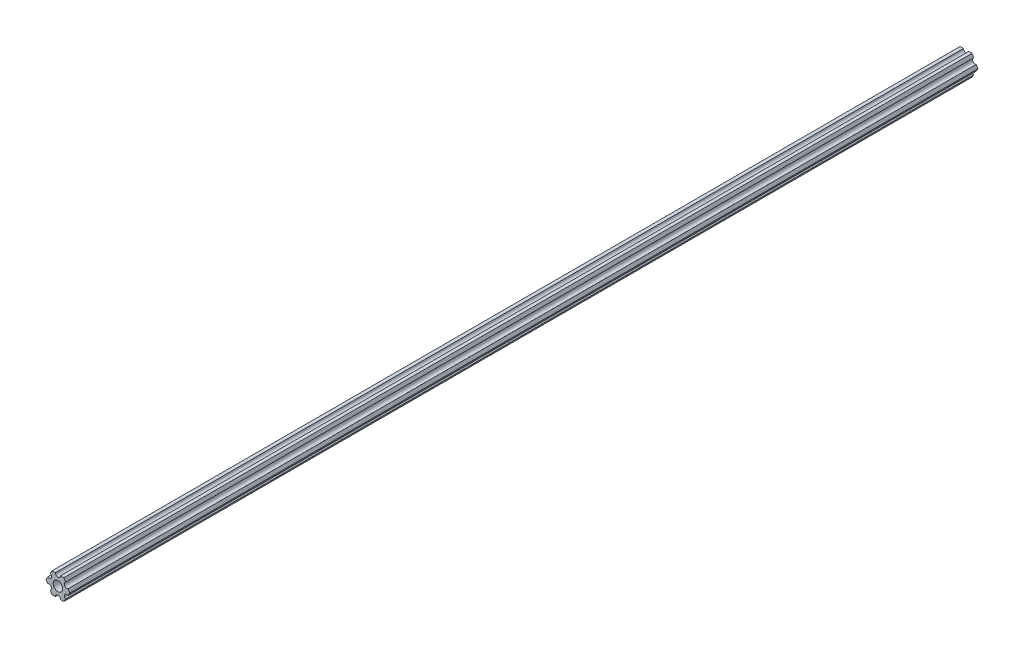
ISO-10303-21;
HEADER;
FILE_DESCRIPTION(('STEP AP214'),'2;1');
FILE_NAME('part.step','',(''),(''),'','','');
FILE_SCHEMA(('AUTOMOTIVE_DESIGN { 1 0 10303 214 1 1 1 1 }'));
ENDSEC;
DATA;
#1=APPLICATION_CONTEXT('core data for automotive mechanical design processes');
#2=APPLICATION_PROTOCOL_DEFINITION('international standard','automotive_design',2000,#1);
#3=PRODUCT_CONTEXT('',#1,'mechanical');
#4=PRODUCT('Part','Part','',(#3));
#5=PRODUCT_RELATED_PRODUCT_CATEGORY('part','',(#4));
#6=PRODUCT_DEFINITION_FORMATION('','',#4);
#7=PRODUCT_DEFINITION_CONTEXT('part definition',#1,'design');
#8=PRODUCT_DEFINITION('design','',#6,#7);
#9=PRODUCT_DEFINITION_SHAPE('','',#8);
#10=(LENGTH_UNIT() NAMED_UNIT(*) SI_UNIT(.MILLI.,.METRE.));
#11=(NAMED_UNIT(*) PLANE_ANGLE_UNIT() SI_UNIT($,.RADIAN.));
#12=(NAMED_UNIT(*) SI_UNIT($,.STERADIAN.) SOLID_ANGLE_UNIT());
#13=UNCERTAINTY_MEASURE_WITH_UNIT(LENGTH_MEASURE(1.E-05),#10,'distance_accuracy_value','');
#14=(GEOMETRIC_REPRESENTATION_CONTEXT(3) GLOBAL_UNCERTAINTY_ASSIGNED_CONTEXT((#13)) GLOBAL_UNIT_ASSIGNED_CONTEXT((#10,
#11,#12)) REPRESENTATION_CONTEXT('',''));
#15=CARTESIAN_POINT('',(0.,0.,0.));
#16=DIRECTION('',(0.,0.,1.));
#17=DIRECTION('',(1.,0.,0.));
#18=AXIS2_PLACEMENT_3D('',#15,#16,#17);
#19=CARTESIAN_POINT('',(6.29301142309098,-1.80018429024546,85.725));
#20=DIRECTION('',(-0.866025434075723,0.499999947533953,0.));
#21=DIRECTION('',(0.,0.,1.));
#22=AXIS2_PLACEMENT_3D('',#19,#20,#21);
#23=PLANE('',#22);
#24=DIRECTION('',(0.,0.,1.));
#25=VECTOR('',#24,1.);
#26=CARTESIAN_POINT('',(7.33234841870827,4.44212519169686E-07,85.725));
#27=LINE('',#26,#25);
#28=CARTESIAN_POINT('',(7.33234841870826,4.44212518961143E-07,-473.075));
#29=VERTEX_POINT('',#28);
#30=CARTESIAN_POINT('',(7.33234841870826,4.44212519315656E-07,85.725));
#31=VERTEX_POINT('',#30);
#32=EDGE_CURVE('E12',#29,#31,#27,.T.);
#33=ORIENTED_EDGE('',*,*,#32,.T.);
#34=DIRECTION('',(0.499999947533953,0.866025434075723,0.));
#35=VECTOR('',#34,1.);
#36=CARTESIAN_POINT('',(6.29301142309098,-1.80018429024546,85.725));
#37=LINE('',#36,#35);
#38=CARTESIAN_POINT('',(6.29301142309098,-1.80018429024546,85.725));
#39=VERTEX_POINT('',#38);
#40=EDGE_CURVE('E303',#39,#31,#37,.T.);
#41=ORIENTED_EDGE('',*,*,#40,.F.);
#42=DIRECTION('',(0.,0.,-1.));
#43=VECTOR('',#42,1.);
#44=CARTESIAN_POINT('',(6.29301142309098,-1.80018429024546,85.725));
#45=LINE('',#44,#43);
#46=CARTESIAN_POINT('',(6.29301142309098,-1.80018429024546,-473.075));
#47=VERTEX_POINT('',#46);
#48=EDGE_CURVE('E302',#39,#47,#45,.T.);
#49=ORIENTED_EDGE('',*,*,#48,.T.);
#50=DIRECTION('',(-0.499999947533953,-0.866025434075723,0.));
#51=VECTOR('',#50,1.);
#52=CARTESIAN_POINT('',(6.29301142309098,-1.80018429024546,-473.075));
#53=LINE('',#52,#51);
#54=EDGE_CURVE('E221',#29,#47,#53,.T.);
#55=ORIENTED_EDGE('',*,*,#54,.F.);
#56=EDGE_LOOP('',(#33,#41,#49,#55));
#57=FACE_BOUND('',#56,.T.);
#58=ADVANCED_FACE('F53',(#57),#23,.F.);
#59=CARTESIAN_POINT('',(7.33234841870827,4.44212519169686E-07,85.725));
#60=DIRECTION('',(-0.866025373493145,-0.500000052466057,0.));
#61=DIRECTION('',(-0.500000052466057,0.866025373493145,0.));
#62=AXIS2_PLACEMENT_3D('',#59,#60,#61);
#63=PLANE('',#62);
#64=DIRECTION('',(0.,0.,1.));
#65=VECTOR('',#64,1.);
#66=CARTESIAN_POINT('',(6.29301120497139,1.80018505273894,85.725));
#67=LINE('',#66,#65);
#68=CARTESIAN_POINT('',(6.29301120497139,1.80018505273894,-473.075));
#69=VERTEX_POINT('',#68);
#70=CARTESIAN_POINT('',(6.29301120497139,1.80018505273894,85.725));
#71=VERTEX_POINT('',#70);
#72=EDGE_CURVE('E61',#69,#71,#67,.T.);
#73=ORIENTED_EDGE('',*,*,#72,.T.);
#74=DIRECTION('',(-0.500000052466057,0.866025373493145,0.));
#75=VECTOR('',#74,1.);
#76=CARTESIAN_POINT('',(7.33234841870827,4.44212519198906E-07,85.725));
#77=LINE('',#76,#75);
#78=EDGE_CURVE('E307',#31,#71,#77,.T.);
#79=ORIENTED_EDGE('',*,*,#78,.F.);
#80=ORIENTED_EDGE('',*,*,#32,.F.);
#81=DIRECTION('',(0.500000052466055,-0.866025373493145,0.));
#82=VECTOR('',#81,1.);
#83=CARTESIAN_POINT('',(7.33234841870826,4.44212518961143E-07,-473.075));
#84=LINE('',#83,#82);
#85=EDGE_CURVE('E215',#69,#29,#84,.T.);
#86=ORIENTED_EDGE('',*,*,#85,.F.);
#87=EDGE_LOOP('',(#73,#79,#80,#86));
#88=FACE_BOUND('',#87,.T.);
#89=ADVANCED_FACE('F216',(#88),#63,.F.);
#90=CARTESIAN_POINT('',(4.70551103839172,4.54981561357972,85.725));
#91=DIRECTION('',(-0.866025373493151,-0.500000052466046,0.));
#92=DIRECTION('',(-0.500000052466046,0.866025373493151,0.));
#93=AXIS2_PLACEMENT_3D('',#90,#91,#92);
#94=PLANE('',#93);
#95=DIRECTION('',(0.,0.,1.));
#96=VECTOR('',#95,1.);
#97=CARTESIAN_POINT('',(3.66617382465481,6.35000022210627,85.725));
#98=LINE('',#97,#96);
#99=CARTESIAN_POINT('',(3.66617382465481,6.35000022210627,-473.075));
#100=VERTEX_POINT('',#99);
#101=CARTESIAN_POINT('',(3.66617382465481,6.35000022210627,85.725));
#102=VERTEX_POINT('',#101);
#103=EDGE_CURVE('E213',#100,#102,#98,.T.);
#104=ORIENTED_EDGE('',*,*,#103,.T.);
#105=DIRECTION('',(-0.500000052466046,0.866025373493151,0.));
#106=VECTOR('',#105,1.);
#107=CARTESIAN_POINT('',(4.70551103839172,4.54981561357972,85.725));
#108=LINE('',#107,#106);
#109=CARTESIAN_POINT('',(4.70551103839172,4.54981561357972,85.725));
#110=VERTEX_POINT('',#109);
#111=EDGE_CURVE('E338',#110,#102,#108,.T.);
#112=ORIENTED_EDGE('',*,*,#111,.F.);
#113=DIRECTION('',(0.,0.,1.));
#114=VECTOR('',#113,1.);
#115=CARTESIAN_POINT('',(4.70551103839172,4.54981561357972,85.725));
#116=LINE('',#115,#114);
#117=CARTESIAN_POINT('',(4.70551103839172,4.54981561357972,-473.075));
#118=VERTEX_POINT('',#117);
#119=EDGE_CURVE('E301',#118,#110,#116,.T.);
#120=ORIENTED_EDGE('',*,*,#119,.F.);
#121=DIRECTION('',(0.500000052466045,-0.866025373493151,0.));
#122=VECTOR('',#121,1.);
#123=CARTESIAN_POINT('',(4.70551103839172,4.54981561357972,-473.075));
#124=LINE('',#123,#122);
#125=EDGE_CURVE('E227',#100,#118,#124,.T.);
#126=ORIENTED_EDGE('',*,*,#125,.F.);
#127=EDGE_LOOP('',(#104,#112,#120,#126));
#128=FACE_BOUND('',#127,.T.);
#129=ADVANCED_FACE('F414',(#128),#94,.F.);
#130=CARTESIAN_POINT('',(3.66617382465481,6.35000022210627,85.725));
#131=DIRECTION('',(6.05825850611185E-08,-1.,0.));
#132=DIRECTION('',(0.,0.,-1.));
#133=AXIS2_PLACEMENT_3D('',#130,#131,#132);
#134=PLANE('',#133);
#135=DIRECTION('',(0.,0.,1.));
#136=VECTOR('',#135,1.);
#137=CARTESIAN_POINT('',(1.58749961530074,6.35000009617482,85.725));
#138=LINE('',#137,#136);
#139=CARTESIAN_POINT('',(1.58749961530073,6.35000015914054,-473.075));
#140=VERTEX_POINT('',#139);
#141=CARTESIAN_POINT('',(1.58749961530073,6.35000015914054,85.725));
#142=VERTEX_POINT('',#141);
#143=EDGE_CURVE('E335',#140,#142,#138,.T.);
#144=ORIENTED_EDGE('',*,*,#143,.T.);
#145=DIRECTION('',(-1.,0.,0.));
#146=VECTOR('',#145,1.);
#147=CARTESIAN_POINT('',(5.49926112168156,6.35000022210627,85.725));
#148=LINE('',#147,#146);
#149=EDGE_CURVE('E342',#102,#142,#148,.T.);
#150=ORIENTED_EDGE('',*,*,#149,.F.);
#151=ORIENTED_EDGE('',*,*,#103,.F.);
#152=DIRECTION('',(1.,3.02912931564594E-08,0.));
#153=VECTOR('',#152,1.);
#154=CARTESIAN_POINT('',(3.66617382465481,6.35000022210627,-473.075));
#155=LINE('',#154,#153);
#156=EDGE_CURVE('E289',#140,#100,#155,.T.);
#157=ORIENTED_EDGE('',*,*,#156,.F.);
#158=EDGE_LOOP('',(#144,#150,#151,#157));
#159=FACE_BOUND('',#158,.T.);
#160=ADVANCED_FACE('F417',(#159),#134,.F.);
#161=CARTESIAN_POINT('',(-3.84699260060323E-07,6.35,85.725));
#162=DIRECTION('',(0.,0.,-1.));
#163=DIRECTION('',(-1.,0.,0.));
#164=AXIS2_PLACEMENT_3D('',#161,#162,#163);
#165=CYLINDRICAL_SURFACE('',#164,1.5875);
#166=DIRECTION('',(0.,0.,1.));
#167=VECTOR('',#166,1.);
#168=CARTESIAN_POINT('',(-1.58750038469926,6.34999990382518,85.725));
#169=LINE('',#168,#167);
#170=CARTESIAN_POINT('',(-1.58750038469926,6.34999990382519,-473.075));
#171=VERTEX_POINT('',#170);
#172=CARTESIAN_POINT('',(-1.58750038469926,6.34999990382519,85.725));
#173=VERTEX_POINT('',#172);
#174=EDGE_CURVE('E332',#171,#173,#169,.T.);
#175=ORIENTED_EDGE('',*,*,#174,.T.);
#176=CARTESIAN_POINT('',(-3.84699260060323E-07,6.35,85.725));
#177=DIRECTION('',(0.,0.,-1.));
#178=DIRECTION('',(-1.,0.,0.));
#179=AXIS2_PLACEMENT_3D('',#176,#177,#178);
#180=CIRCLE('',#179,1.5875);
#181=EDGE_CURVE('E346',#142,#173,#180,.T.);
#182=ORIENTED_EDGE('',*,*,#181,.F.);
#183=ORIENTED_EDGE('',*,*,#143,.F.);
#184=CARTESIAN_POINT('',(-3.84699260060323E-07,6.35,-473.075));
#185=DIRECTION('',(0.,0.,1.));
#186=DIRECTION('',(-1.,0.,0.));
#187=AXIS2_PLACEMENT_3D('',#184,#185,#186);
#188=CIRCLE('',#187,1.5875);
#189=EDGE_CURVE('E285',#171,#140,#188,.T.);
#190=ORIENTED_EDGE('',*,*,#189,.F.);
#191=EDGE_LOOP('',(#175,#182,#183,#190));
#192=FACE_BOUND('',#191,.T.);
#193=ADVANCED_FACE('F466',(#192),#165,.F.);
#194=CARTESIAN_POINT('',(-1.58750038469926,6.34999990382518,85.725));
#195=DIRECTION('',(6.05825963273174E-08,-1.,0.));
#196=DIRECTION('',(0.,0.,-1.));
#197=AXIS2_PLACEMENT_3D('',#194,#195,#196);
#198=PLANE('',#197);
#199=DIRECTION('',(0.,0.,1.));
#200=VECTOR('',#199,1.);
#201=CARTESIAN_POINT('',(-3.66617459405349,6.3499997778937,85.725));
#202=LINE('',#201,#200);
#203=CARTESIAN_POINT('',(-3.66617454558244,6.34999986184803,-473.075));
#204=VERTEX_POINT('',#203);
#205=CARTESIAN_POINT('',(-3.66617454558244,6.34999986184803,85.725));
#206=VERTEX_POINT('',#205);
#207=EDGE_CURVE('E325',#204,#206,#202,.T.);
#208=ORIENTED_EDGE('',*,*,#207,.T.);
#209=DIRECTION('',(-1.,0.,0.));
#210=VECTOR('',#209,1.);
#211=CARTESIAN_POINT('',(5.49926112168156,6.34999990382519,85.725));
#212=LINE('',#211,#210);
#213=EDGE_CURVE('E350',#173,#206,#212,.T.);
#214=ORIENTED_EDGE('',*,*,#213,.F.);
#215=ORIENTED_EDGE('',*,*,#174,.F.);
#216=DIRECTION('',(1.,2.0194198968488E-08,0.));
#217=VECTOR('',#216,1.);
#218=CARTESIAN_POINT('',(-1.58750038469926,6.34999990382519,-473.075));
#219=LINE('',#218,#217);
#220=EDGE_CURVE('E281',#204,#171,#219,.T.);
#221=ORIENTED_EDGE('',*,*,#220,.F.);
#222=EDGE_LOOP('',(#208,#214,#215,#221));
#223=FACE_BOUND('',#222,.T.);
#224=ADVANCED_FACE('F463',(#223),#198,.F.);
#225=CARTESIAN_POINT('',(-3.66617459405349,6.3499997778937,85.725));
#226=DIRECTION('',(0.866025434075729,-0.499999947533942,0.));
#227=DIRECTION('',(0.,0.,-1.));
#228=AXIS2_PLACEMENT_3D('',#225,#226,#227);
#229=PLANE('',#228);
#230=DIRECTION('',(0.,0.,1.));
#231=VECTOR('',#230,1.);
#232=CARTESIAN_POINT('',(-4.70551158967065,4.54981504343587,85.725));
#233=LINE('',#232,#231);
#234=CARTESIAN_POINT('',(-4.70551158967065,4.54981504343587,-473.075));
#235=VERTEX_POINT('',#234);
#236=CARTESIAN_POINT('',(-4.70551158967065,4.54981504343587,85.725));
#237=VERTEX_POINT('',#236);
#238=EDGE_CURVE('E322',#235,#237,#233,.T.);
#239=ORIENTED_EDGE('',*,*,#238,.T.);
#240=DIRECTION('',(-0.499999947533943,-0.866025434075729,0.));
#241=VECTOR('',#240,1.);
#242=CARTESIAN_POINT('',(-3.66617459405349,6.3499997778937,85.725));
#243=LINE('',#242,#241);
#244=EDGE_CURVE('E354',#206,#237,#243,.T.);
#245=ORIENTED_EDGE('',*,*,#244,.F.);
#246=ORIENTED_EDGE('',*,*,#207,.F.);
#247=DIRECTION('',(0.499999947533939,0.866025434075731,0.));
#248=VECTOR('',#247,1.);
#249=CARTESIAN_POINT('',(-3.66617454558244,6.34999986184803,-473.075));
#250=LINE('',#249,#248);
#251=EDGE_CURVE('E277',#235,#204,#250,.T.);
#252=ORIENTED_EDGE('',*,*,#251,.F.);
#253=EDGE_LOOP('',(#239,#245,#246,#252));
#254=FACE_BOUND('',#253,.T.);
#255=ADVANCED_FACE('F459',(#254),#229,.F.);
#256=CARTESIAN_POINT('',(-5.49926150638082,3.17499966684067,85.725));
#257=DIRECTION('',(0.,0.,-1.));
#258=DIRECTION('',(-1.,0.,0.));
#259=AXIS2_PLACEMENT_3D('',#256,#257,#258);
#260=CYLINDRICAL_SURFACE('',#259,1.5875);
#261=DIRECTION('',(0.,0.,1.));
#262=VECTOR('',#261,1.);
#263=CARTESIAN_POINT('',(-6.29301142309098,1.80018429024547,85.725));
#264=LINE('',#263,#262);
#265=CARTESIAN_POINT('',(-6.29301142309098,1.80018429024546,-473.075));
#266=VERTEX_POINT('',#265);
#267=CARTESIAN_POINT('',(-6.29301142309098,1.80018429024547,85.725));
#268=VERTEX_POINT('',#267);
#269=EDGE_CURVE('E326',#266,#268,#264,.T.);
#270=ORIENTED_EDGE('',*,*,#269,.T.);
#271=CARTESIAN_POINT('',(-5.49926150638082,3.17499966684067,85.725));
#272=DIRECTION('',(0.,0.,-1.));
#273=DIRECTION('',(-1.,0.,0.));
#274=AXIS2_PLACEMENT_3D('',#271,#272,#273);
#275=CIRCLE('',#274,1.5875);
#276=EDGE_CURVE('E364',#237,#268,#275,.T.);
#277=ORIENTED_EDGE('',*,*,#276,.F.);
#278=ORIENTED_EDGE('',*,*,#238,.F.);
#279=CARTESIAN_POINT('',(-5.49926150638082,3.17499966684067,-473.075));
#280=DIRECTION('',(0.,0.,1.));
#281=DIRECTION('',(-1.,0.,0.));
#282=AXIS2_PLACEMENT_3D('',#279,#280,#281);
#283=CIRCLE('',#282,1.5875);
#284=EDGE_CURVE('E273',#266,#235,#283,.T.);
#285=ORIENTED_EDGE('',*,*,#284,.F.);
#286=EDGE_LOOP('',(#270,#277,#278,#285));
#287=FACE_BOUND('',#286,.T.);
#288=ADVANCED_FACE('F455',(#287),#260,.F.);
#289=CARTESIAN_POINT('',(-6.29301142309098,1.80018429024547,85.725));
#290=DIRECTION('',(0.866025434075724,-0.499999947533952,0.));
#291=DIRECTION('',(0.,0.,-1.));
#292=AXIS2_PLACEMENT_3D('',#289,#290,#291);
#293=PLANE('',#292);
#294=DIRECTION('',(0.,0.,1.));
#295=VECTOR('',#294,1.);
#296=CARTESIAN_POINT('',(-7.33234841870827,-4.44212523790841E-07,85.725));
#297=LINE('',#296,#295);
#298=CARTESIAN_POINT('',(-7.33234841870826,-4.44212524036367E-07,-473.075));
#299=VERTEX_POINT('',#298);
#300=CARTESIAN_POINT('',(-7.33234841870826,-4.44212524036367E-07,85.725));
#301=VERTEX_POINT('',#300);
#302=EDGE_CURVE('E319',#299,#301,#297,.T.);
#303=ORIENTED_EDGE('',*,*,#302,.T.);
#304=DIRECTION('',(-0.499999947533952,-0.866025434075724,0.));
#305=VECTOR('',#304,1.);
#306=CARTESIAN_POINT('',(-6.29301142309098,1.80018429024547,85.725));
#307=LINE('',#306,#305);
#308=EDGE_CURVE('E360',#268,#301,#307,.T.);
#309=ORIENTED_EDGE('',*,*,#308,.F.);
#310=ORIENTED_EDGE('',*,*,#269,.F.);
#311=DIRECTION('',(0.499999947533951,0.866025434075724,0.));
#312=VECTOR('',#311,1.);
#313=CARTESIAN_POINT('',(-6.29301142309098,1.80018429024547,-473.075));
#314=LINE('',#313,#312);
#315=EDGE_CURVE('E269',#299,#266,#314,.T.);
#316=ORIENTED_EDGE('',*,*,#315,.F.);
#317=EDGE_LOOP('',(#303,#309,#310,#316));
#318=FACE_BOUND('',#317,.T.);
#319=ADVANCED_FACE('F451',(#318),#293,.F.);
#320=CARTESIAN_POINT('',(-7.33234841870827,-4.44212523790841E-07,85.725));
#321=DIRECTION('',(0.866025373493151,0.500000052466045,0.));
#322=DIRECTION('',(0.,0.,-1.));
#323=AXIS2_PLACEMENT_3D('',#320,#321,#322);
#324=PLANE('',#323);
#325=DIRECTION('',(0.,0.,1.));
#326=VECTOR('',#325,1.);
#327=CARTESIAN_POINT('',(-6.29301120497141,-1.80018505273897,85.725));
#328=LINE('',#327,#326);
#329=CARTESIAN_POINT('',(-6.29301120497141,-1.80018505273897,-473.075));
#330=VERTEX_POINT('',#329);
#331=CARTESIAN_POINT('',(-6.29301120497141,-1.80018505273897,85.725));
#332=VERTEX_POINT('',#331);
#333=EDGE_CURVE('E312',#330,#332,#328,.T.);
#334=ORIENTED_EDGE('',*,*,#333,.T.);
#335=DIRECTION('',(0.500000052466045,-0.866025373493151,0.));
#336=VECTOR('',#335,1.);
#337=CARTESIAN_POINT('',(-7.33234841870827,-4.44212523969395E-07,85.725));
#338=LINE('',#337,#336);
#339=EDGE_CURVE('E355',#301,#332,#338,.T.);
#340=ORIENTED_EDGE('',*,*,#339,.F.);
#341=ORIENTED_EDGE('',*,*,#302,.F.);
#342=DIRECTION('',(-0.500000052466045,0.866025373493152,0.));
#343=VECTOR('',#342,1.);
#344=CARTESIAN_POINT('',(-7.33234841870826,-4.44212524036367E-07,-473.075));
#345=LINE('',#344,#343);
#346=EDGE_CURVE('E265',#330,#299,#345,.T.);
#347=ORIENTED_EDGE('',*,*,#346,.F.);
#348=EDGE_LOOP('',(#334,#340,#341,#347));
#349=FACE_BOUND('',#348,.T.);
#350=ADVANCED_FACE('F447',(#349),#324,.F.);
#351=CARTESIAN_POINT('',(-5.49926112168156,-3.17500033315934,85.725));
#352=DIRECTION('',(0.,0.,-1.));
#353=DIRECTION('',(-1.,0.,0.));
#354=AXIS2_PLACEMENT_3D('',#351,#352,#353);
#355=CYLINDRICAL_SURFACE('',#354,1.5875);
#356=DIRECTION('',(0.,0.,1.));
#357=VECTOR('',#356,1.);
#358=CARTESIAN_POINT('',(-4.70551103839172,-4.54981561357972,85.725));
#359=LINE('',#358,#357);
#360=CARTESIAN_POINT('',(-4.70551103839172,-4.54981561357972,-473.075));
#361=VERTEX_POINT('',#360);
#362=CARTESIAN_POINT('',(-4.70551103839172,-4.54981561357972,85.725));
#363=VERTEX_POINT('',#362);
#364=EDGE_CURVE('E309',#361,#363,#359,.T.);
#365=ORIENTED_EDGE('',*,*,#364,.T.);
#366=CARTESIAN_POINT('',(-5.49926112168156,-3.17500033315934,85.725));
#367=DIRECTION('',(0.,0.,-1.));
#368=DIRECTION('',(-1.,0.,0.));
#369=AXIS2_PLACEMENT_3D('',#366,#367,#368);
#370=CIRCLE('',#369,1.5875);
#371=EDGE_CURVE('E359',#332,#363,#370,.T.);
#372=ORIENTED_EDGE('',*,*,#371,.F.);
#373=ORIENTED_EDGE('',*,*,#333,.F.);
#374=CARTESIAN_POINT('',(-5.49926112168156,-3.17500033315934,-473.075));
#375=DIRECTION('',(0.,0.,1.));
#376=DIRECTION('',(-1.,0.,0.));
#377=AXIS2_PLACEMENT_3D('',#374,#375,#376);
#378=CIRCLE('',#377,1.5875);
#379=EDGE_CURVE('E261',#361,#330,#378,.T.);
#380=ORIENTED_EDGE('',*,*,#379,.F.);
#381=EDGE_LOOP('',(#365,#372,#373,#380));
#382=FACE_BOUND('',#381,.T.);
#383=ADVANCED_FACE('F443',(#382),#355,.F.);
#384=CARTESIAN_POINT('',(-4.70551103839172,-4.54981561357972,85.725));
#385=DIRECTION('',(0.866025373493152,0.500000052466045,0.));
#386=DIRECTION('',(0.,0.,-1.));
#387=AXIS2_PLACEMENT_3D('',#384,#385,#386);
#388=PLANE('',#387);
#389=DIRECTION('',(0.,0.,1.));
#390=VECTOR('',#389,1.);
#391=CARTESIAN_POINT('',(-3.66617382465481,-6.35000022210628,85.725));
#392=LINE('',#391,#390);
#393=CARTESIAN_POINT('',(-3.66617382465481,-6.35000022210628,-473.075));
#394=VERTEX_POINT('',#393);
#395=CARTESIAN_POINT('',(-3.66617382465481,-6.35000022210628,85.725));
#396=VERTEX_POINT('',#395);
#397=EDGE_CURVE('E313',#394,#396,#392,.T.);
#398=ORIENTED_EDGE('',*,*,#397,.T.);
#399=DIRECTION('',(0.500000052466045,-0.866025373493151,0.));
#400=VECTOR('',#399,1.);
#401=CARTESIAN_POINT('',(-4.70551103839172,-4.54981561357972,85.725));
#402=LINE('',#401,#400);
#403=EDGE_CURVE('E374',#363,#396,#402,.T.);
#404=ORIENTED_EDGE('',*,*,#403,.F.);
#405=ORIENTED_EDGE('',*,*,#364,.F.);
#406=DIRECTION('',(-0.500000052466043,0.866025373493152,0.));
#407=VECTOR('',#406,1.);
#408=CARTESIAN_POINT('',(-4.70551103839172,-4.54981561357972,-473.075));
#409=LINE('',#408,#407);
#410=EDGE_CURVE('E257',#394,#361,#409,.T.);
#411=ORIENTED_EDGE('',*,*,#410,.F.);
#412=EDGE_LOOP('',(#398,#404,#405,#411));
#413=FACE_BOUND('',#412,.T.);
#414=ADVANCED_FACE('F439',(#413),#388,.F.);
#415=CARTESIAN_POINT('',(-3.66617382465481,-6.35000022210628,85.725));
#416=DIRECTION('',(-6.05825854783851E-08,1.,0.));
#417=DIRECTION('',(0.,0.,1.));
#418=AXIS2_PLACEMENT_3D('',#415,#416,#417);
#419=PLANE('',#418);
#420=DIRECTION('',(0.,0.,1.));
#421=VECTOR('',#420,1.);
#422=CARTESIAN_POINT('',(-1.58749961530074,-6.35,85.725));
#423=LINE('',#422,#421);
#424=CARTESIAN_POINT('',(-1.58749961530073,-6.35000011105314,-473.075));
#425=VERTEX_POINT('',#424);
#426=CARTESIAN_POINT('',(-1.58749961530073,-6.35000011105314,85.725));
#427=VERTEX_POINT('',#426);
#428=EDGE_CURVE('E84',#425,#427,#423,.T.);
#429=ORIENTED_EDGE('',*,*,#428,.T.);
#430=DIRECTION('',(1.,0.,0.));
#431=VECTOR('',#430,1.);
#432=CARTESIAN_POINT('',(5.49926112168156,-6.35000022210628,85.725));
#433=LINE('',#432,#431);
#434=EDGE_CURVE('E378',#396,#427,#433,.T.);
#435=ORIENTED_EDGE('',*,*,#434,.F.);
#436=ORIENTED_EDGE('',*,*,#397,.F.);
#437=DIRECTION('',(-0.999999999999999,-5.34249856349036E-08,0.));
#438=VECTOR('',#437,1.);
#439=CARTESIAN_POINT('',(-3.66617382465481,-6.35000022210628,-473.075));
#440=LINE('',#439,#438);
#441=EDGE_CURVE('E253',#425,#394,#440,.T.);
#442=ORIENTED_EDGE('',*,*,#441,.F.);
#443=EDGE_LOOP('',(#429,#435,#436,#442));
#444=FACE_BOUND('',#443,.T.);
#445=ADVANCED_FACE('F436',(#444),#419,.F.);
#446=CARTESIAN_POINT('',(3.8469926204343E-07,-6.35,85.725));
#447=DIRECTION('',(0.,0.,-1.));
#448=DIRECTION('',(-1.,0.,0.));
#449=AXIS2_PLACEMENT_3D('',#446,#447,#448);
#450=CYLINDRICAL_SURFACE('',#449,1.5875);
#451=DIRECTION('',(0.,0.,1.));
#452=VECTOR('',#451,1.);
#453=CARTESIAN_POINT('',(1.58750038469926,-6.34999990382518,85.725));
#454=LINE('',#453,#452);
#455=CARTESIAN_POINT('',(1.58750038469926,-6.34999990382519,-473.075));
#456=VERTEX_POINT('',#455);
#457=CARTESIAN_POINT('',(1.58750038469926,-6.34999990382519,85.725));
#458=VERTEX_POINT('',#457);
#459=EDGE_CURVE('E73',#456,#458,#454,.T.);
#460=ORIENTED_EDGE('',*,*,#459,.T.);
#461=CARTESIAN_POINT('',(3.8469926204343E-07,-6.35,85.725));
#462=DIRECTION('',(0.,0.,-1.));
#463=DIRECTION('',(-1.,0.,0.));
#464=AXIS2_PLACEMENT_3D('',#461,#462,#463);
#465=CIRCLE('',#464,1.5875);
#466=EDGE_CURVE('E382',#427,#458,#465,.T.);
#467=ORIENTED_EDGE('',*,*,#466,.F.);
#468=ORIENTED_EDGE('',*,*,#428,.F.);
#469=CARTESIAN_POINT('',(3.8469926204343E-07,-6.35,-473.075));
#470=DIRECTION('',(0.,0.,1.));
#471=DIRECTION('',(-1.,0.,0.));
#472=AXIS2_PLACEMENT_3D('',#469,#470,#471);
#473=CIRCLE('',#472,1.5875);
#474=EDGE_CURVE('E249',#456,#425,#473,.T.);
#475=ORIENTED_EDGE('',*,*,#474,.F.);
#476=EDGE_LOOP('',(#460,#467,#468,#475));
#477=FACE_BOUND('',#476,.T.);
#478=ADVANCED_FACE('F434',(#477),#450,.F.);
#479=CARTESIAN_POINT('',(1.58750038469926,-6.34999990382518,85.725));
#480=DIRECTION('',(-6.05825721258438E-08,1.,0.));
#481=DIRECTION('',(0.,0.,1.));
#482=AXIS2_PLACEMENT_3D('',#479,#480,#481);
#483=PLANE('',#482);
#484=DIRECTION('',(0.,0.,1.));
#485=VECTOR('',#484,1.);
#486=CARTESIAN_POINT('',(3.66617459405346,-6.34999977789375,85.725));
#487=LINE('',#486,#485);
#488=CARTESIAN_POINT('',(3.66617454558244,-6.34999986184804,-473.075));
#489=VERTEX_POINT('',#488);
#490=CARTESIAN_POINT('',(3.66617454558244,-6.34999986184804,85.725));
#491=VERTEX_POINT('',#490);
#492=EDGE_CURVE('E383',#489,#491,#487,.T.);
#493=ORIENTED_EDGE('',*,*,#492,.T.);
#494=DIRECTION('',(1.,0.,0.));
#495=VECTOR('',#494,1.);
#496=CARTESIAN_POINT('',(5.49926112168156,-6.34999990382519,85.725));
#497=LINE('',#496,#495);
#498=EDGE_CURVE('E390',#458,#491,#497,.T.);
#499=ORIENTED_EDGE('',*,*,#498,.F.);
#500=ORIENTED_EDGE('',*,*,#459,.F.);
#501=DIRECTION('',(-1.,-2.01941943785532E-08,0.));
#502=VECTOR('',#501,1.);
#503=CARTESIAN_POINT('',(1.58750038469926,-6.34999990382519,-473.075));
#504=LINE('',#503,#502);
#505=EDGE_CURVE('E245',#489,#456,#504,.T.);
#506=ORIENTED_EDGE('',*,*,#505,.F.);
#507=EDGE_LOOP('',(#493,#499,#500,#506));
#508=FACE_BOUND('',#507,.T.);
#509=ADVANCED_FACE('F433',(#508),#483,.F.);
#510=CARTESIAN_POINT('',(3.66617459405346,-6.34999977789375,85.725));
#511=DIRECTION('',(-0.86602543407573,0.499999947533941,0.));
#512=DIRECTION('',(0.,0.,1.));
#513=AXIS2_PLACEMENT_3D('',#510,#511,#512);
#514=PLANE('',#513);
#515=DIRECTION('',(0.,0.,-1.));
#516=VECTOR('',#515,1.);
#517=CARTESIAN_POINT('',(4.70551158967065,-4.54981504343587,85.725));
#518=LINE('',#517,#516);
#519=CARTESIAN_POINT('',(4.70551158967065,-4.54981504343587,85.725));
#520=VERTEX_POINT('',#519);
#521=CARTESIAN_POINT('',(4.70551158967065,-4.54981504343587,-473.075));
#522=VERTEX_POINT('',#521);
#523=EDGE_CURVE('E386',#520,#522,#518,.T.);
#524=ORIENTED_EDGE('',*,*,#523,.F.);
#525=DIRECTION('',(0.49999994753394,0.86602543407573,0.));
#526=VECTOR('',#525,1.);
#527=CARTESIAN_POINT('',(3.66617459405346,-6.34999977789376,85.725));
#528=LINE('',#527,#526);
#529=EDGE_CURVE('E308',#491,#520,#528,.T.);
#530=ORIENTED_EDGE('',*,*,#529,.F.);
#531=ORIENTED_EDGE('',*,*,#492,.F.);
#532=DIRECTION('',(-0.499999947533941,-0.86602543407573,0.));
#533=VECTOR('',#532,1.);
#534=CARTESIAN_POINT('',(3.66617454558244,-6.34999986184804,-473.075));
#535=LINE('',#534,#533);
#536=EDGE_CURVE('E241',#522,#489,#535,.T.);
#537=ORIENTED_EDGE('',*,*,#536,.F.);
#538=EDGE_LOOP('',(#524,#530,#531,#537));
#539=FACE_BOUND('',#538,.T.);
#540=ADVANCED_FACE('F430',(#539),#514,.F.);
#541=CARTESIAN_POINT('',(5.49926112168156,3.17500033315934,85.725));
#542=DIRECTION('',(0.,0.,1.));
#543=DIRECTION('',(1.,0.,0.));
#544=AXIS2_PLACEMENT_3D('',#541,#542,#543);
#545=PLANE('',#544);
#546=CARTESIAN_POINT('',(0.,0.,85.725));
#547=DIRECTION('',(0.,0.,-1.));
#548=DIRECTION('',(-1.,0.,0.));
#549=AXIS2_PLACEMENT_3D('',#546,#547,#548);
#550=CIRCLE('',#549,2.9337);
#551=CARTESIAN_POINT('',(-2.9337,0.,85.725));
#552=VERTEX_POINT('',#551);
#553=EDGE_CURVE('E294',#552,#552,#550,.T.);
#554=ORIENTED_EDGE('',*,*,#553,.T.);
#555=EDGE_LOOP('',(#554));
#556=FACE_BOUND('',#555,.T.);
#557=ORIENTED_EDGE('',*,*,#529,.T.);
#558=CARTESIAN_POINT('',(5.49926150638082,-3.17499966684067,85.725));
#559=DIRECTION('',(0.,0.,-1.));
#560=DIRECTION('',(-1.,0.,0.));
#561=AXIS2_PLACEMENT_3D('',#558,#559,#560);
#562=CIRCLE('',#561,1.5875);
#563=EDGE_CURVE('E298',#520,#39,#562,.T.);
#564=ORIENTED_EDGE('',*,*,#563,.T.);
#565=ORIENTED_EDGE('',*,*,#40,.T.);
#566=ORIENTED_EDGE('',*,*,#78,.T.);
#567=CARTESIAN_POINT('',(5.49926112168156,3.17500033315934,85.725));
#568=DIRECTION('',(0.,0.,-1.));
#569=DIRECTION('',(-1.,0.,0.));
#570=AXIS2_PLACEMENT_3D('',#567,#568,#569);
#571=CIRCLE('',#570,1.5875);
#572=EDGE_CURVE('E208',#71,#110,#571,.T.);
#573=ORIENTED_EDGE('',*,*,#572,.T.);
#574=ORIENTED_EDGE('',*,*,#111,.T.);
#575=ORIENTED_EDGE('',*,*,#149,.T.);
#576=ORIENTED_EDGE('',*,*,#181,.T.);
#577=ORIENTED_EDGE('',*,*,#213,.T.);
#578=ORIENTED_EDGE('',*,*,#244,.T.);
#579=ORIENTED_EDGE('',*,*,#276,.T.);
#580=ORIENTED_EDGE('',*,*,#308,.T.);
#581=ORIENTED_EDGE('',*,*,#339,.T.);
#582=ORIENTED_EDGE('',*,*,#371,.T.);
#583=ORIENTED_EDGE('',*,*,#403,.T.);
#584=ORIENTED_EDGE('',*,*,#434,.T.);
#585=ORIENTED_EDGE('',*,*,#466,.T.);
#586=ORIENTED_EDGE('',*,*,#498,.T.);
#587=EDGE_LOOP('',(#557,#564,#565,#566,#573,#574,#575,#576,#577,#578,#579,#580,#581,#582,#583,
#584,#585,#586));
#588=FACE_BOUND('',#587,.T.);
#589=ADVANCED_FACE('F420',(#556,#588),#545,.T.);
#590=CARTESIAN_POINT('',(5.49926112168156,3.17500033315934,85.725));
#591=DIRECTION('',(0.,0.,-1.));
#592=DIRECTION('',(-1.,0.,0.));
#593=AXIS2_PLACEMENT_3D('',#590,#591,#592);
#594=CYLINDRICAL_SURFACE('',#593,1.5875);
#595=ORIENTED_EDGE('',*,*,#572,.F.);
#596=ORIENTED_EDGE('',*,*,#72,.F.);
#597=CARTESIAN_POINT('',(5.49926112168156,3.17500033315934,-473.075));
#598=DIRECTION('',(0.,0.,1.));
#599=DIRECTION('',(-1.,0.,0.));
#600=AXIS2_PLACEMENT_3D('',#597,#598,#599);
#601=CIRCLE('',#600,1.5875);
#602=EDGE_CURVE('E205',#118,#69,#601,.T.);
#603=ORIENTED_EDGE('',*,*,#602,.F.);
#604=ORIENTED_EDGE('',*,*,#119,.T.);
#605=EDGE_LOOP('',(#595,#596,#603,#604));
#606=FACE_BOUND('',#605,.T.);
#607=ADVANCED_FACE('F202',(#606),#594,.F.);
#608=CARTESIAN_POINT('',(5.49926150638082,-3.17499966684067,85.725));
#609=DIRECTION('',(0.,0.,-1.));
#610=DIRECTION('',(-1.,0.,0.));
#611=AXIS2_PLACEMENT_3D('',#608,#609,#610);
#612=CYLINDRICAL_SURFACE('',#611,1.5875);
#613=ORIENTED_EDGE('',*,*,#563,.F.);
#614=ORIENTED_EDGE('',*,*,#523,.T.);
#615=CARTESIAN_POINT('',(5.49926150638082,-3.17499966684067,-473.075));
#616=DIRECTION('',(0.,0.,1.));
#617=DIRECTION('',(-1.,0.,0.));
#618=AXIS2_PLACEMENT_3D('',#615,#616,#617);
#619=CIRCLE('',#618,1.5875);
#620=EDGE_CURVE('E237',#47,#522,#619,.T.);
#621=ORIENTED_EDGE('',*,*,#620,.F.);
#622=ORIENTED_EDGE('',*,*,#48,.F.);
#623=EDGE_LOOP('',(#613,#614,#621,#622));
#624=FACE_BOUND('',#623,.T.);
#625=ADVANCED_FACE('F425',(#624),#612,.F.);
#626=CARTESIAN_POINT('',(0.,0.,85.725));
#627=DIRECTION('',(0.,0.,-1.));
#628=DIRECTION('',(-1.,0.,0.));
#629=AXIS2_PLACEMENT_3D('',#626,#627,#628);
#630=CYLINDRICAL_SURFACE('',#629,2.9337);
#631=ORIENTED_EDGE('',*,*,#553,.F.);
#632=EDGE_LOOP('',(#631));
#633=FACE_BOUND('',#632,.T.);
#634=CARTESIAN_POINT('',(0.,0.,-473.075));
#635=DIRECTION('',(0.,0.,-1.));
#636=DIRECTION('',(-1.,0.,0.));
#637=AXIS2_PLACEMENT_3D('',#634,#635,#636);
#638=CIRCLE('',#637,2.9337);
#639=CARTESIAN_POINT('',(-2.9337,0.,-473.075));
#640=VERTEX_POINT('',#639);
#641=EDGE_CURVE('E229',#640,#640,#638,.T.);
#642=ORIENTED_EDGE('',*,*,#641,.T.);
#643=EDGE_LOOP('',(#642));
#644=FACE_BOUND('',#643,.T.);
#645=ADVANCED_FACE('F485',(#633,#644),#630,.F.);
#646=CARTESIAN_POINT('',(5.49926112168156,3.17500033315934,-473.075));
#647=DIRECTION('',(0.,0.,-1.));
#648=DIRECTION('',(-1.,0.,0.));
#649=AXIS2_PLACEMENT_3D('',#646,#647,#648);
#650=PLANE('',#649);
#651=ORIENTED_EDGE('',*,*,#602,.T.);
#652=ORIENTED_EDGE('',*,*,#85,.T.);
#653=ORIENTED_EDGE('',*,*,#54,.T.);
#654=ORIENTED_EDGE('',*,*,#620,.T.);
#655=ORIENTED_EDGE('',*,*,#536,.T.);
#656=ORIENTED_EDGE('',*,*,#505,.T.);
#657=ORIENTED_EDGE('',*,*,#474,.T.);
#658=ORIENTED_EDGE('',*,*,#441,.T.);
#659=ORIENTED_EDGE('',*,*,#410,.T.);
#660=ORIENTED_EDGE('',*,*,#379,.T.);
#661=ORIENTED_EDGE('',*,*,#346,.T.);
#662=ORIENTED_EDGE('',*,*,#315,.T.);
#663=ORIENTED_EDGE('',*,*,#284,.T.);
#664=ORIENTED_EDGE('',*,*,#251,.T.);
#665=ORIENTED_EDGE('',*,*,#220,.T.);
#666=ORIENTED_EDGE('',*,*,#189,.T.);
#667=ORIENTED_EDGE('',*,*,#156,.T.);
#668=ORIENTED_EDGE('',*,*,#125,.T.);
#669=EDGE_LOOP('',(#651,#652,#653,#654,#655,#656,#657,#658,#659,#660,#661,#662,#663,#664,#665,
#666,#667,#668));
#670=FACE_BOUND('',#669,.T.);
#671=ORIENTED_EDGE('',*,*,#641,.F.);
#672=EDGE_LOOP('',(#671));
#673=FACE_BOUND('',#672,.T.);
#674=ADVANCED_FACE('F223',(#670,#673),#650,.T.);
#675=CLOSED_SHELL('',(#58,#89,#129,#160,#193,#224,#255,#288,#319,#350,#383,#414,#445,#478,#509,
#540,#589,#607,#625,#645,#674));
#676=MANIFOLD_SOLID_BREP('B2',#675);
#677=ADVANCED_BREP_SHAPE_REPRESENTATION('',(#18,#676),#14);
#678=SHAPE_DEFINITION_REPRESENTATION(#9,#677);
ENDSEC;
END-ISO-10303-21;
